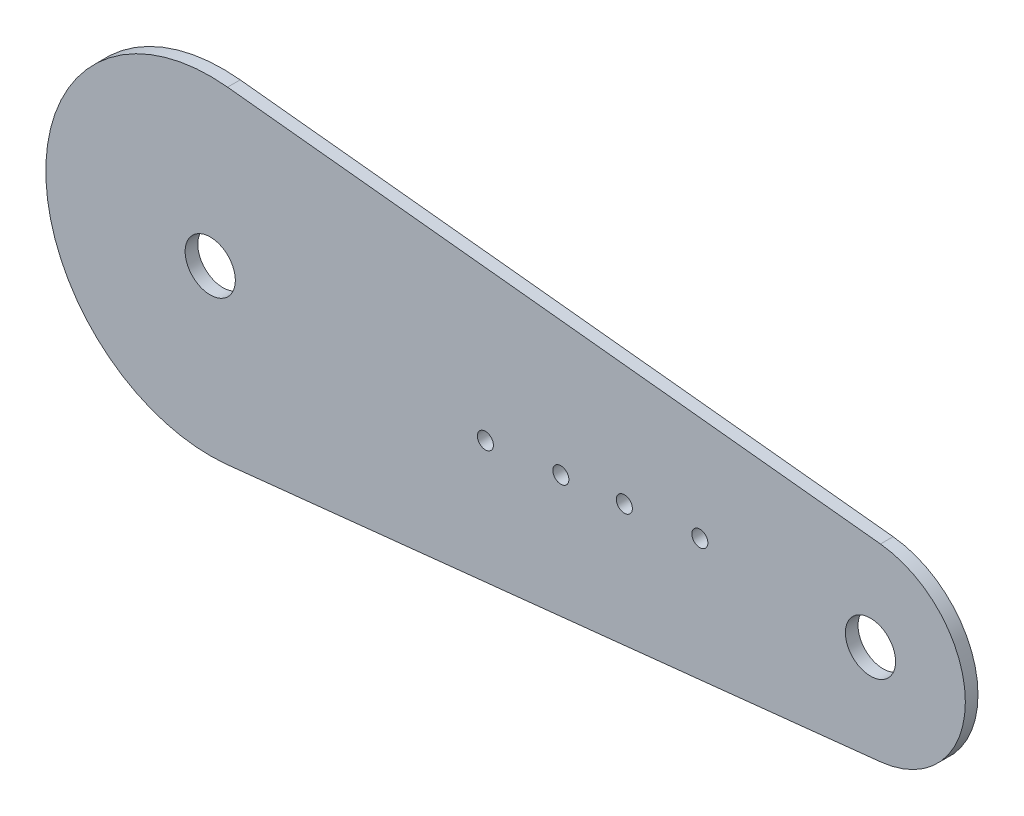
ISO-10303-21;
HEADER;
FILE_DESCRIPTION(('STEP AP214'),'2;1');
FILE_NAME('part.step','',(''),(''),'','','');
FILE_SCHEMA(('AUTOMOTIVE_DESIGN { 1 0 10303 214 1 1 1 1 }'));
ENDSEC;
DATA;
#1=APPLICATION_CONTEXT('core data for automotive mechanical design processes');
#2=APPLICATION_PROTOCOL_DEFINITION('international standard','automotive_design',2000,#1);
#3=PRODUCT_CONTEXT('',#1,'mechanical');
#4=PRODUCT('Part','Part','',(#3));
#5=PRODUCT_RELATED_PRODUCT_CATEGORY('part','',(#4));
#6=PRODUCT_DEFINITION_FORMATION('','',#4);
#7=PRODUCT_DEFINITION_CONTEXT('part definition',#1,'design');
#8=PRODUCT_DEFINITION('design','',#6,#7);
#9=PRODUCT_DEFINITION_SHAPE('','',#8);
#10=(LENGTH_UNIT() NAMED_UNIT(*) SI_UNIT(.MILLI.,.METRE.));
#11=(NAMED_UNIT(*) PLANE_ANGLE_UNIT() SI_UNIT($,.RADIAN.));
#12=(NAMED_UNIT(*) SI_UNIT($,.STERADIAN.) SOLID_ANGLE_UNIT());
#13=UNCERTAINTY_MEASURE_WITH_UNIT(LENGTH_MEASURE(1.E-05),#10,'distance_accuracy_value','');
#14=(GEOMETRIC_REPRESENTATION_CONTEXT(3) GLOBAL_UNCERTAINTY_ASSIGNED_CONTEXT((#13)) GLOBAL_UNIT_ASSIGNED_CONTEXT((#10,
#11,#12)) REPRESENTATION_CONTEXT('',''));
#15=CARTESIAN_POINT('',(0.,0.,0.));
#16=DIRECTION('',(0.,0.,1.));
#17=DIRECTION('',(1.,0.,0.));
#18=AXIS2_PLACEMENT_3D('',#15,#16,#17);
#19=CARTESIAN_POINT('',(-130.5,0.,2.5));
#20=DIRECTION('',(0.,0.,1.));
#21=DIRECTION('',(1.,0.,0.));
#22=AXIS2_PLACEMENT_3D('',#19,#20,#21);
#23=PLANE('',#22);
#24=CARTESIAN_POINT('',(-130.5,0.,2.5));
#25=DIRECTION('',(0.,0.,1.));
#26=DIRECTION('',(1.,0.,0.));
#27=AXIS2_PLACEMENT_3D('',#24,#25,#26);
#28=CIRCLE('',#27,9.921875);
#29=CARTESIAN_POINT('',(-120.578125,0.,2.5));
#30=VERTEX_POINT('',#29);
#31=EDGE_CURVE('E114',#30,#30,#28,.T.);
#32=ORIENTED_EDGE('',*,*,#31,.F.);
#33=EDGE_LOOP('',(#32));
#34=FACE_BOUND('',#33,.T.);
#35=CARTESIAN_POINT('',(130.5,0.,2.5));
#36=DIRECTION('',(0.,0.,1.));
#37=DIRECTION('',(1.,0.,0.));
#38=AXIS2_PLACEMENT_3D('',#35,#36,#37);
#39=CIRCLE('',#38,9.921875);
#40=CARTESIAN_POINT('',(140.421875,0.,2.5));
#41=VERTEX_POINT('',#40);
#42=EDGE_CURVE('E120',#41,#41,#39,.T.);
#43=ORIENTED_EDGE('',*,*,#42,.F.);
#44=EDGE_LOOP('',(#43));
#45=FACE_BOUND('',#44,.T.);
#46=CARTESIAN_POINT('',(-21.7378478604078,-5.39410364247292,2.5));
#47=DIRECTION('',(0.,0.,1.));
#48=DIRECTION('',(1.,0.,0.));
#49=AXIS2_PLACEMENT_3D('',#46,#47,#48);
#50=CIRCLE('',#49,3.175);
#51=CARTESIAN_POINT('',(-18.5628478604078,-5.39410364247292,2.5));
#52=VERTEX_POINT('',#51);
#53=EDGE_CURVE('E133',#52,#52,#50,.T.);
#54=ORIENTED_EDGE('',*,*,#53,.F.);
#55=EDGE_LOOP('',(#54));
#56=FACE_BOUND('',#55,.T.);
#57=CARTESIAN_POINT('',(63.0361498342929,3.50684657977138,2.5));
#58=DIRECTION('',(0.,0.,1.));
#59=DIRECTION('',(1.,0.,0.));
#60=AXIS2_PLACEMENT_3D('',#57,#58,#59);
#61=CIRCLE('',#60,3.17500000000001);
#62=CARTESIAN_POINT('',(66.2111498342929,3.50684657977138,2.5));
#63=VERTEX_POINT('',#62);
#64=EDGE_CURVE('E107',#63,#63,#61,.T.);
#65=ORIENTED_EDGE('',*,*,#64,.F.);
#66=EDGE_LOOP('',(#65));
#67=FACE_BOUND('',#66,.T.);
#68=CARTESIAN_POINT('',(-130.5,0.,2.5));
#69=DIRECTION('',(0.,0.,1.));
#70=DIRECTION('',(1.,0.,0.));
#71=AXIS2_PLACEMENT_3D('',#68,#69,#70);
#72=CIRCLE('',#71,65.);
#73=CARTESIAN_POINT('',(-123.651340996169,64.6381920372874,2.5));
#74=VERTEX_POINT('',#73);
#75=CARTESIAN_POINT('',(-123.651340996169,-64.6381920372874,2.5));
#76=VERTEX_POINT('',#75);
#77=EDGE_CURVE('E91',#74,#76,#72,.T.);
#78=ORIENTED_EDGE('',*,*,#77,.T.);
#79=DIRECTION('',(0.994433723650575,0.10536398467433,0.));
#80=VECTOR('',#79,1.);
#81=CARTESIAN_POINT('',(134.451149425287,-37.2912646368965,2.5));
#82=LINE('',#81,#80);
#83=CARTESIAN_POINT('',(134.451149425287,-37.2912646368965,2.5));
#84=VERTEX_POINT('',#83);
#85=EDGE_CURVE('E86',#76,#84,#82,.T.);
#86=ORIENTED_EDGE('',*,*,#85,.T.);
#87=CARTESIAN_POINT('',(130.5,0.,2.5));
#88=DIRECTION('',(0.,0.,1.));
#89=DIRECTION('',(1.,0.,0.));
#90=AXIS2_PLACEMENT_3D('',#87,#88,#89);
#91=CIRCLE('',#90,37.5);
#92=CARTESIAN_POINT('',(134.451149425287,37.2912646368966,2.5));
#93=VERTEX_POINT('',#92);
#94=EDGE_CURVE('E89',#84,#93,#91,.T.);
#95=ORIENTED_EDGE('',*,*,#94,.T.);
#96=DIRECTION('',(-0.994433723650575,0.105363984674329,0.));
#97=VECTOR('',#96,1.);
#98=CARTESIAN_POINT('',(-123.651340996169,64.6381920372874,2.5));
#99=LINE('',#98,#97);
#100=EDGE_CURVE('E56',#93,#74,#99,.T.);
#101=ORIENTED_EDGE('',*,*,#100,.T.);
#102=EDGE_LOOP('',(#78,#86,#95,#101));
#103=FACE_BOUND('',#102,.T.);
#104=CARTESIAN_POINT('',(33.2001581538492,0.37417991309694,2.5));
#105=DIRECTION('',(0.,0.,1.));
#106=DIRECTION('',(1.,0.,0.));
#107=AXIS2_PLACEMENT_3D('',#104,#105,#106);
#108=CIRCLE('',#107,3.175);
#109=CARTESIAN_POINT('',(36.3751581538492,0.37417991309694,2.5));
#110=VERTEX_POINT('',#109);
#111=EDGE_CURVE('E139',#110,#110,#108,.T.);
#112=ORIENTED_EDGE('',*,*,#111,.F.);
#113=EDGE_LOOP('',(#112));
#114=FACE_BOUND('',#113,.T.);
#115=CARTESIAN_POINT('',(8.09814382003589,-2.26143697579848,2.5));
#116=DIRECTION('',(0.,0.,1.));
#117=DIRECTION('',(1.,0.,0.));
#118=AXIS2_PLACEMENT_3D('',#115,#116,#117);
#119=CIRCLE('',#118,3.175);
#120=CARTESIAN_POINT('',(11.2731438200359,-2.26143697579848,2.5));
#121=VERTEX_POINT('',#120);
#122=EDGE_CURVE('E127',#121,#121,#119,.T.);
#123=ORIENTED_EDGE('',*,*,#122,.F.);
#124=EDGE_LOOP('',(#123));
#125=FACE_BOUND('',#124,.T.);
#126=ADVANCED_FACE('F37',(#34,#45,#56,#67,#103,#114,#125),#23,.T.);
#127=CARTESIAN_POINT('',(-130.5,0.,-2.5));
#128=DIRECTION('',(0.,0.,1.));
#129=DIRECTION('',(1.,0.,0.));
#130=AXIS2_PLACEMENT_3D('',#127,#128,#129);
#131=PLANE('',#130);
#132=CARTESIAN_POINT('',(-130.5,0.,-2.5));
#133=DIRECTION('',(0.,0.,1.));
#134=DIRECTION('',(1.,0.,0.));
#135=AXIS2_PLACEMENT_3D('',#132,#133,#134);
#136=CIRCLE('',#135,9.921875);
#137=CARTESIAN_POINT('',(-120.578125,0.,-2.5));
#138=VERTEX_POINT('',#137);
#139=EDGE_CURVE('E41',#138,#138,#136,.T.);
#140=ORIENTED_EDGE('',*,*,#139,.T.);
#141=EDGE_LOOP('',(#140));
#142=FACE_BOUND('',#141,.T.);
#143=CARTESIAN_POINT('',(130.5,0.,-2.5));
#144=DIRECTION('',(0.,0.,1.));
#145=DIRECTION('',(1.,0.,0.));
#146=AXIS2_PLACEMENT_3D('',#143,#144,#145);
#147=CIRCLE('',#146,9.921875);
#148=CARTESIAN_POINT('',(140.421875,0.,-2.5));
#149=VERTEX_POINT('',#148);
#150=EDGE_CURVE('E112',#149,#149,#147,.T.);
#151=ORIENTED_EDGE('',*,*,#150,.T.);
#152=EDGE_LOOP('',(#151));
#153=FACE_BOUND('',#152,.T.);
#154=CARTESIAN_POINT('',(-130.5,0.,-2.5));
#155=DIRECTION('',(0.,0.,1.));
#156=DIRECTION('',(1.,0.,0.));
#157=AXIS2_PLACEMENT_3D('',#154,#155,#156);
#158=CIRCLE('',#157,65.);
#159=CARTESIAN_POINT('',(-123.651340996169,64.6381920372874,-2.5));
#160=VERTEX_POINT('',#159);
#161=CARTESIAN_POINT('',(-123.651340996169,-64.6381920372874,-2.5));
#162=VERTEX_POINT('',#161);
#163=EDGE_CURVE('E104',#160,#162,#158,.T.);
#164=ORIENTED_EDGE('',*,*,#163,.F.);
#165=DIRECTION('',(-0.994433723650575,0.105363984674329,0.));
#166=VECTOR('',#165,1.);
#167=CARTESIAN_POINT('',(-123.651340996169,64.6381920372874,-2.5));
#168=LINE('',#167,#166);
#169=CARTESIAN_POINT('',(134.451149425287,37.2912646368966,-2.5));
#170=VERTEX_POINT('',#169);
#171=EDGE_CURVE('E79',#170,#160,#168,.T.);
#172=ORIENTED_EDGE('',*,*,#171,.F.);
#173=CARTESIAN_POINT('',(130.5,0.,-2.5));
#174=DIRECTION('',(0.,0.,1.));
#175=DIRECTION('',(1.,0.,0.));
#176=AXIS2_PLACEMENT_3D('',#173,#174,#175);
#177=CIRCLE('',#176,37.5);
#178=CARTESIAN_POINT('',(134.451149425287,-37.2912646368965,-2.5));
#179=VERTEX_POINT('',#178);
#180=EDGE_CURVE('E73',#179,#170,#177,.T.);
#181=ORIENTED_EDGE('',*,*,#180,.F.);
#182=DIRECTION('',(0.994433723650575,0.10536398467433,0.));
#183=VECTOR('',#182,1.);
#184=CARTESIAN_POINT('',(134.451149425287,-37.2912646368965,-2.5));
#185=LINE('',#184,#183);
#186=EDGE_CURVE('E95',#162,#179,#185,.T.);
#187=ORIENTED_EDGE('',*,*,#186,.F.);
#188=EDGE_LOOP('',(#164,#172,#181,#187));
#189=FACE_BOUND('',#188,.T.);
#190=CARTESIAN_POINT('',(63.0361498342929,3.50684657977138,-2.5));
#191=DIRECTION('',(0.,0.,1.));
#192=DIRECTION('',(1.,0.,0.));
#193=AXIS2_PLACEMENT_3D('',#190,#191,#192);
#194=CIRCLE('',#193,3.17500000000001);
#195=CARTESIAN_POINT('',(66.2111498342929,3.50684657977138,-2.5));
#196=VERTEX_POINT('',#195);
#197=EDGE_CURVE('E142',#196,#196,#194,.T.);
#198=ORIENTED_EDGE('',*,*,#197,.T.);
#199=EDGE_LOOP('',(#198));
#200=FACE_BOUND('',#199,.T.);
#201=CARTESIAN_POINT('',(33.2001581538492,0.37417991309694,-2.5));
#202=DIRECTION('',(0.,0.,1.));
#203=DIRECTION('',(1.,0.,0.));
#204=AXIS2_PLACEMENT_3D('',#201,#202,#203);
#205=CIRCLE('',#204,3.175);
#206=CARTESIAN_POINT('',(36.3751581538492,0.37417991309694,-2.5));
#207=VERTEX_POINT('',#206);
#208=EDGE_CURVE('E136',#207,#207,#205,.T.);
#209=ORIENTED_EDGE('',*,*,#208,.T.);
#210=EDGE_LOOP('',(#209));
#211=FACE_BOUND('',#210,.T.);
#212=CARTESIAN_POINT('',(-21.7378478604078,-5.39410364247292,-2.5));
#213=DIRECTION('',(0.,0.,1.));
#214=DIRECTION('',(1.,0.,0.));
#215=AXIS2_PLACEMENT_3D('',#212,#213,#214);
#216=CIRCLE('',#215,3.175);
#217=CARTESIAN_POINT('',(-18.5628478604078,-5.39410364247292,-2.5));
#218=VERTEX_POINT('',#217);
#219=EDGE_CURVE('E130',#218,#218,#216,.T.);
#220=ORIENTED_EDGE('',*,*,#219,.T.);
#221=EDGE_LOOP('',(#220));
#222=FACE_BOUND('',#221,.T.);
#223=CARTESIAN_POINT('',(8.09814382003589,-2.26143697579848,-2.5));
#224=DIRECTION('',(0.,0.,1.));
#225=DIRECTION('',(1.,0.,0.));
#226=AXIS2_PLACEMENT_3D('',#223,#224,#225);
#227=CIRCLE('',#226,3.175);
#228=CARTESIAN_POINT('',(11.2731438200359,-2.26143697579848,-2.5));
#229=VERTEX_POINT('',#228);
#230=EDGE_CURVE('E118',#229,#229,#227,.T.);
#231=ORIENTED_EDGE('',*,*,#230,.T.);
#232=EDGE_LOOP('',(#231));
#233=FACE_BOUND('',#232,.T.);
#234=ADVANCED_FACE('F150',(#142,#153,#189,#200,#211,#222,#233),#131,.F.);
#235=CARTESIAN_POINT('',(-130.5,0.,2.5));
#236=DIRECTION('',(0.,0.,-1.));
#237=DIRECTION('',(-1.,0.,0.));
#238=AXIS2_PLACEMENT_3D('',#235,#236,#237);
#239=CYLINDRICAL_SURFACE('',#238,65.);
#240=ORIENTED_EDGE('',*,*,#163,.T.);
#241=DIRECTION('',(0.,0.,-1.));
#242=VECTOR('',#241,1.);
#243=CARTESIAN_POINT('',(-123.651340996169,-64.6381920372874,2.5));
#244=LINE('',#243,#242);
#245=EDGE_CURVE('E11',#76,#162,#244,.T.);
#246=ORIENTED_EDGE('',*,*,#245,.F.);
#247=ORIENTED_EDGE('',*,*,#77,.F.);
#248=DIRECTION('',(0.,0.,-1.));
#249=VECTOR('',#248,1.);
#250=CARTESIAN_POINT('',(-123.651340996169,64.6381920372874,2.5));
#251=LINE('',#250,#249);
#252=EDGE_CURVE('E100',#74,#160,#251,.T.);
#253=ORIENTED_EDGE('',*,*,#252,.T.);
#254=EDGE_LOOP('',(#240,#246,#247,#253));
#255=FACE_BOUND('',#254,.T.);
#256=ADVANCED_FACE('F39',(#255),#239,.T.);
#257=CARTESIAN_POINT('',(134.451149425287,-37.2912646368965,2.5));
#258=DIRECTION('',(-0.10536398467433,0.994433723650575,0.));
#259=DIRECTION('',(-0.994433723650575,-0.10536398467433,0.));
#260=AXIS2_PLACEMENT_3D('',#257,#258,#259);
#261=PLANE('',#260);
#262=ORIENTED_EDGE('',*,*,#186,.T.);
#263=DIRECTION('',(0.,0.,-1.));
#264=VECTOR('',#263,1.);
#265=CARTESIAN_POINT('',(134.451149425287,-37.2912646368965,2.5));
#266=LINE('',#265,#264);
#267=EDGE_CURVE('E47',#84,#179,#266,.T.);
#268=ORIENTED_EDGE('',*,*,#267,.F.);
#269=ORIENTED_EDGE('',*,*,#85,.F.);
#270=ORIENTED_EDGE('',*,*,#245,.T.);
#271=EDGE_LOOP('',(#262,#268,#269,#270));
#272=FACE_BOUND('',#271,.T.);
#273=ADVANCED_FACE('F94',(#272),#261,.F.);
#274=CARTESIAN_POINT('',(130.5,0.,2.5));
#275=DIRECTION('',(0.,0.,-1.));
#276=DIRECTION('',(-1.,0.,0.));
#277=AXIS2_PLACEMENT_3D('',#274,#275,#276);
#278=CYLINDRICAL_SURFACE('',#277,37.5);
#279=ORIENTED_EDGE('',*,*,#180,.T.);
#280=DIRECTION('',(0.,0.,-1.));
#281=VECTOR('',#280,1.);
#282=CARTESIAN_POINT('',(134.451149425287,37.2912646368966,2.5));
#283=LINE('',#282,#281);
#284=EDGE_CURVE('E96',#93,#170,#283,.T.);
#285=ORIENTED_EDGE('',*,*,#284,.F.);
#286=ORIENTED_EDGE('',*,*,#94,.F.);
#287=ORIENTED_EDGE('',*,*,#267,.T.);
#288=EDGE_LOOP('',(#279,#285,#286,#287));
#289=FACE_BOUND('',#288,.T.);
#290=ADVANCED_FACE('F98',(#289),#278,.T.);
#291=CARTESIAN_POINT('',(-123.651340996169,64.6381920372874,2.5));
#292=DIRECTION('',(-0.105363984674329,-0.994433723650575,0.));
#293=DIRECTION('',(0.994433723650575,-0.105363984674329,0.));
#294=AXIS2_PLACEMENT_3D('',#291,#292,#293);
#295=PLANE('',#294);
#296=ORIENTED_EDGE('',*,*,#171,.T.);
#297=ORIENTED_EDGE('',*,*,#252,.F.);
#298=ORIENTED_EDGE('',*,*,#100,.F.);
#299=ORIENTED_EDGE('',*,*,#284,.T.);
#300=EDGE_LOOP('',(#296,#297,#298,#299));
#301=FACE_BOUND('',#300,.T.);
#302=ADVANCED_FACE('F156',(#301),#295,.F.);
#303=CARTESIAN_POINT('',(63.0361498342929,3.50684657977138,2.5));
#304=DIRECTION('',(0.,0.,-1.));
#305=DIRECTION('',(-1.,0.,0.));
#306=AXIS2_PLACEMENT_3D('',#303,#304,#305);
#307=CYLINDRICAL_SURFACE('',#306,3.17500000000001);
#308=ORIENTED_EDGE('',*,*,#64,.T.);
#309=EDGE_LOOP('',(#308));
#310=FACE_BOUND('',#309,.T.);
#311=ORIENTED_EDGE('',*,*,#197,.F.);
#312=EDGE_LOOP('',(#311));
#313=FACE_BOUND('',#312,.T.);
#314=ADVANCED_FACE('F153',(#310,#313),#307,.F.);
#315=CARTESIAN_POINT('',(33.2001581538492,0.37417991309694,2.5));
#316=DIRECTION('',(0.,0.,-1.));
#317=DIRECTION('',(-1.,0.,0.));
#318=AXIS2_PLACEMENT_3D('',#315,#316,#317);
#319=CYLINDRICAL_SURFACE('',#318,3.175);
#320=ORIENTED_EDGE('',*,*,#111,.T.);
#321=EDGE_LOOP('',(#320));
#322=FACE_BOUND('',#321,.T.);
#323=ORIENTED_EDGE('',*,*,#208,.F.);
#324=EDGE_LOOP('',(#323));
#325=FACE_BOUND('',#324,.T.);
#326=ADVANCED_FACE('F155',(#322,#325),#319,.F.);
#327=CARTESIAN_POINT('',(-21.7378478604078,-5.39410364247292,2.5));
#328=DIRECTION('',(0.,0.,-1.));
#329=DIRECTION('',(-1.,0.,0.));
#330=AXIS2_PLACEMENT_3D('',#327,#328,#329);
#331=CYLINDRICAL_SURFACE('',#330,3.175);
#332=ORIENTED_EDGE('',*,*,#53,.T.);
#333=EDGE_LOOP('',(#332));
#334=FACE_BOUND('',#333,.T.);
#335=ORIENTED_EDGE('',*,*,#219,.F.);
#336=EDGE_LOOP('',(#335));
#337=FACE_BOUND('',#336,.T.);
#338=ADVANCED_FACE('F163',(#334,#337),#331,.F.);
#339=CARTESIAN_POINT('',(8.09814382003589,-2.26143697579848,2.5));
#340=DIRECTION('',(0.,0.,-1.));
#341=DIRECTION('',(-1.,0.,0.));
#342=AXIS2_PLACEMENT_3D('',#339,#340,#341);
#343=CYLINDRICAL_SURFACE('',#342,3.175);
#344=ORIENTED_EDGE('',*,*,#122,.T.);
#345=EDGE_LOOP('',(#344));
#346=FACE_BOUND('',#345,.T.);
#347=ORIENTED_EDGE('',*,*,#230,.F.);
#348=EDGE_LOOP('',(#347));
#349=FACE_BOUND('',#348,.T.);
#350=ADVANCED_FACE('F206',(#346,#349),#343,.F.);
#351=CARTESIAN_POINT('',(130.5,0.,-7.5));
#352=DIRECTION('',(0.,0.,1.));
#353=DIRECTION('',(1.,0.,0.));
#354=AXIS2_PLACEMENT_3D('',#351,#352,#353);
#355=CYLINDRICAL_SURFACE('',#354,9.921875);
#356=ORIENTED_EDGE('',*,*,#42,.T.);
#357=EDGE_LOOP('',(#356));
#358=FACE_BOUND('',#357,.T.);
#359=ORIENTED_EDGE('',*,*,#150,.F.);
#360=EDGE_LOOP('',(#359));
#361=FACE_BOUND('',#360,.T.);
#362=ADVANCED_FACE('F200',(#358,#361),#355,.F.);
#363=CARTESIAN_POINT('',(-130.5,0.,-7.5));
#364=DIRECTION('',(0.,0.,1.));
#365=DIRECTION('',(1.,0.,0.));
#366=AXIS2_PLACEMENT_3D('',#363,#364,#365);
#367=CYLINDRICAL_SURFACE('',#366,9.921875);
#368=ORIENTED_EDGE('',*,*,#31,.T.);
#369=EDGE_LOOP('',(#368));
#370=FACE_BOUND('',#369,.T.);
#371=ORIENTED_EDGE('',*,*,#139,.F.);
#372=EDGE_LOOP('',(#371));
#373=FACE_BOUND('',#372,.T.);
#374=ADVANCED_FACE('F205',(#370,#373),#367,.F.);
#375=CLOSED_SHELL('',(#126,#234,#256,#273,#290,#302,#314,#326,#338,#350,#362,#374));
#376=MANIFOLD_SOLID_BREP('B2',#375);
#377=ADVANCED_BREP_SHAPE_REPRESENTATION('',(#18,#376),#14);
#378=SHAPE_DEFINITION_REPRESENTATION(#9,#377);
ENDSEC;
END-ISO-10303-21;
